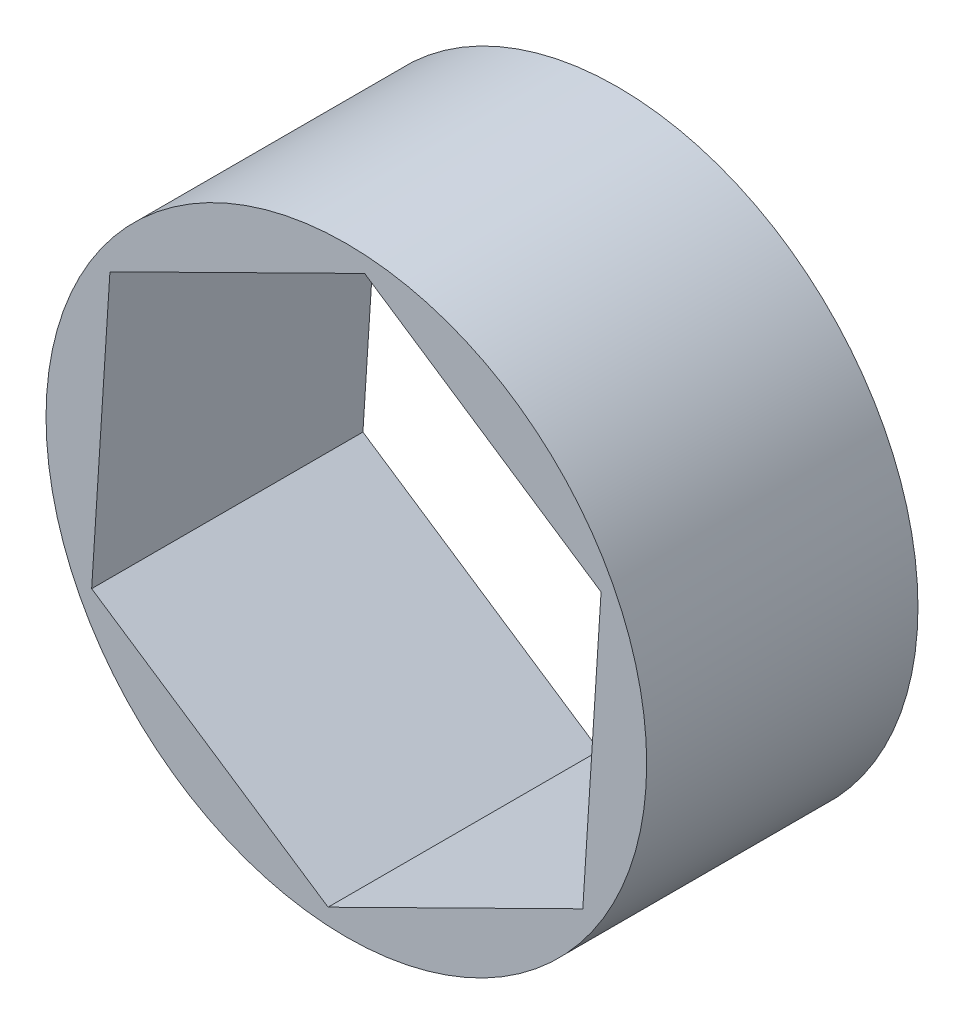
ISO-10303-21;
HEADER;
FILE_DESCRIPTION(('STEP AP214'),'2;1');
FILE_NAME('part.step','',(''),(''),'','','');
FILE_SCHEMA(('AUTOMOTIVE_DESIGN { 1 0 10303 214 1 1 1 1 }'));
ENDSEC;
DATA;
#1=APPLICATION_CONTEXT('core data for automotive mechanical design processes');
#2=APPLICATION_PROTOCOL_DEFINITION('international standard','automotive_design',2000,#1);
#3=PRODUCT_CONTEXT('',#1,'mechanical');
#4=PRODUCT('Part','Part','',(#3));
#5=PRODUCT_RELATED_PRODUCT_CATEGORY('part','',(#4));
#6=PRODUCT_DEFINITION_FORMATION('','',#4);
#7=PRODUCT_DEFINITION_CONTEXT('part definition',#1,'design');
#8=PRODUCT_DEFINITION('design','',#6,#7);
#9=PRODUCT_DEFINITION_SHAPE('','',#8);
#10=(LENGTH_UNIT() NAMED_UNIT(*) SI_UNIT(.MILLI.,.METRE.));
#11=(NAMED_UNIT(*) PLANE_ANGLE_UNIT() SI_UNIT($,.RADIAN.));
#12=(NAMED_UNIT(*) SI_UNIT($,.STERADIAN.) SOLID_ANGLE_UNIT());
#13=UNCERTAINTY_MEASURE_WITH_UNIT(LENGTH_MEASURE(1.E-05),#10,'distance_accuracy_value','');
#14=(GEOMETRIC_REPRESENTATION_CONTEXT(3) GLOBAL_UNCERTAINTY_ASSIGNED_CONTEXT((#13)) GLOBAL_UNIT_ASSIGNED_CONTEXT((#10,
#11,#12)) REPRESENTATION_CONTEXT('',''));
#15=CARTESIAN_POINT('',(0.,0.,0.));
#16=DIRECTION('',(0.,0.,1.));
#17=DIRECTION('',(1.,0.,0.));
#18=AXIS2_PLACEMENT_3D('',#15,#16,#17);
#19=CARTESIAN_POINT('',(0.,0.,7.));
#20=DIRECTION('',(0.,0.,1.));
#21=DIRECTION('',(1.,0.,0.));
#22=AXIS2_PLACEMENT_3D('',#19,#20,#21);
#23=PLANE('',#22);
#24=CARTESIAN_POINT('',(0.,0.,7.));
#25=DIRECTION('',(0.,0.,1.));
#26=DIRECTION('',(1.,0.,0.));
#27=AXIS2_PLACEMENT_3D('',#24,#25,#26);
#28=CIRCLE('',#27,7.75);
#29=CARTESIAN_POINT('',(7.75,0.,7.));
#30=VERTEX_POINT('',#29);
#31=EDGE_CURVE('E11',#30,#30,#28,.T.);
#32=ORIENTED_EDGE('',*,*,#31,.T.);
#33=EDGE_LOOP('',(#32));
#34=FACE_BOUND('',#33,.T.);
#35=DIRECTION('',(-0.0643593142463306,-0.997926790235507,0.));
#36=VECTOR('',#35,1.);
#37=CARTESIAN_POINT('',(-6.10088265997386,4.06725510664916,7.));
#38=LINE('',#37,#36);
#39=CARTESIAN_POINT('',(-6.10088265997386,4.06725510664916,7.));
#40=VERTEX_POINT('',#39);
#41=CARTESIAN_POINT('',(-6.57278757601708,-3.24989181572076,7.));
#42=VERTEX_POINT('',#41);
#43=EDGE_CURVE('E94',#40,#42,#38,.T.);
#44=ORIENTED_EDGE('',*,*,#43,.F.);
#45=DIRECTION('',(-0.896409608584179,-0.443226594010286,0.));
#46=VECTOR('',#45,1.);
#47=CARTESIAN_POINT('',(0.471904916043227,7.31714692236992,7.));
#48=LINE('',#47,#46);
#49=CARTESIAN_POINT('',(0.471904916043227,7.31714692236992,7.));
#50=VERTEX_POINT('',#49);
#51=EDGE_CURVE('E86',#50,#40,#48,.T.);
#52=ORIENTED_EDGE('',*,*,#51,.F.);
#53=DIRECTION('',(-0.832050294337849,0.554700196225221,0.));
#54=VECTOR('',#53,1.);
#55=CARTESIAN_POINT('',(6.57278757601709,3.24989181572076,7.));
#56=LINE('',#55,#54);
#57=CARTESIAN_POINT('',(6.57278757601709,3.24989181572076,7.));
#58=VERTEX_POINT('',#57);
#59=EDGE_CURVE('E114',#58,#50,#56,.T.);
#60=ORIENTED_EDGE('',*,*,#59,.F.);
#61=DIRECTION('',(0.0643593142463307,0.997926790235507,0.));
#62=VECTOR('',#61,1.);
#63=CARTESIAN_POINT('',(6.10088265997386,-4.06725510664916,7.));
#64=LINE('',#63,#62);
#65=CARTESIAN_POINT('',(6.10088265997386,-4.06725510664916,7.));
#66=VERTEX_POINT('',#65);
#67=EDGE_CURVE('E112',#66,#58,#64,.T.);
#68=ORIENTED_EDGE('',*,*,#67,.F.);
#69=DIRECTION('',(0.896409608584179,0.443226594010286,0.));
#70=VECTOR('',#69,1.);
#71=CARTESIAN_POINT('',(-0.471904916043223,-7.31714692236992,7.));
#72=LINE('',#71,#70);
#73=CARTESIAN_POINT('',(-0.471904916043223,-7.31714692236992,7.));
#74=VERTEX_POINT('',#73);
#75=EDGE_CURVE('E108',#74,#66,#72,.T.);
#76=ORIENTED_EDGE('',*,*,#75,.F.);
#77=DIRECTION('',(0.832050294337849,-0.554700196225222,0.));
#78=VECTOR('',#77,1.);
#79=CARTESIAN_POINT('',(-6.57278757601708,-3.24989181572076,7.));
#80=LINE('',#79,#78);
#81=EDGE_CURVE('E106',#42,#74,#80,.T.);
#82=ORIENTED_EDGE('',*,*,#81,.F.);
#83=EDGE_LOOP('',(#44,#52,#60,#68,#76,#82));
#84=FACE_BOUND('',#83,.T.);
#85=ADVANCED_FACE('F33',(#34,#84),#23,.T.);
#86=CARTESIAN_POINT('',(0.,0.,0.));
#87=DIRECTION('',(0.,0.,1.));
#88=DIRECTION('',(1.,0.,0.));
#89=AXIS2_PLACEMENT_3D('',#86,#87,#88);
#90=PLANE('',#89);
#91=CARTESIAN_POINT('',(0.,0.,0.));
#92=DIRECTION('',(0.,0.,1.));
#93=DIRECTION('',(1.,0.,0.));
#94=AXIS2_PLACEMENT_3D('',#91,#92,#93);
#95=CIRCLE('',#94,7.75);
#96=CARTESIAN_POINT('',(7.75,0.,0.));
#97=VERTEX_POINT('',#96);
#98=EDGE_CURVE('E37',#97,#97,#95,.T.);
#99=ORIENTED_EDGE('',*,*,#98,.F.);
#100=EDGE_LOOP('',(#99));
#101=FACE_BOUND('',#100,.T.);
#102=DIRECTION('',(-0.896409608584179,-0.443226594010286,0.));
#103=VECTOR('',#102,1.);
#104=CARTESIAN_POINT('',(0.471904916043227,7.31714692236992,0.));
#105=LINE('',#104,#103);
#106=CARTESIAN_POINT('',(0.471904916043227,7.31714692236992,0.));
#107=VERTEX_POINT('',#106);
#108=CARTESIAN_POINT('',(-6.10088265997386,4.06725510664916,0.));
#109=VERTEX_POINT('',#108);
#110=EDGE_CURVE('E56',#107,#109,#105,.T.);
#111=ORIENTED_EDGE('',*,*,#110,.T.);
#112=DIRECTION('',(-0.0643593142463306,-0.997926790235507,0.));
#113=VECTOR('',#112,1.);
#114=CARTESIAN_POINT('',(-6.10088265997386,4.06725510664916,0.));
#115=LINE('',#114,#113);
#116=CARTESIAN_POINT('',(-6.57278757601708,-3.24989181572076,0.));
#117=VERTEX_POINT('',#116);
#118=EDGE_CURVE('E101',#109,#117,#115,.T.);
#119=ORIENTED_EDGE('',*,*,#118,.T.);
#120=DIRECTION('',(0.832050294337849,-0.554700196225222,0.));
#121=VECTOR('',#120,1.);
#122=CARTESIAN_POINT('',(-6.57278757601708,-3.24989181572076,0.));
#123=LINE('',#122,#121);
#124=CARTESIAN_POINT('',(-0.471904916043223,-7.31714692236992,0.));
#125=VERTEX_POINT('',#124);
#126=EDGE_CURVE('E118',#117,#125,#123,.T.);
#127=ORIENTED_EDGE('',*,*,#126,.T.);
#128=DIRECTION('',(0.896409608584179,0.443226594010286,0.));
#129=VECTOR('',#128,1.);
#130=CARTESIAN_POINT('',(-0.471904916043223,-7.31714692236992,0.));
#131=LINE('',#130,#129);
#132=CARTESIAN_POINT('',(6.10088265997386,-4.06725510664916,0.));
#133=VERTEX_POINT('',#132);
#134=EDGE_CURVE('E121',#125,#133,#131,.T.);
#135=ORIENTED_EDGE('',*,*,#134,.T.);
#136=DIRECTION('',(0.0643593142463307,0.997926790235507,0.));
#137=VECTOR('',#136,1.);
#138=CARTESIAN_POINT('',(6.10088265997386,-4.06725510664916,0.));
#139=LINE('',#138,#137);
#140=CARTESIAN_POINT('',(6.57278757601709,3.24989181572076,0.));
#141=VERTEX_POINT('',#140);
#142=EDGE_CURVE('E124',#133,#141,#139,.T.);
#143=ORIENTED_EDGE('',*,*,#142,.T.);
#144=DIRECTION('',(-0.832050294337849,0.554700196225221,0.));
#145=VECTOR('',#144,1.);
#146=CARTESIAN_POINT('',(6.57278757601709,3.24989181572076,0.));
#147=LINE('',#146,#145);
#148=EDGE_CURVE('E95',#141,#107,#147,.T.);
#149=ORIENTED_EDGE('',*,*,#148,.T.);
#150=EDGE_LOOP('',(#111,#119,#127,#135,#143,#149));
#151=FACE_BOUND('',#150,.T.);
#152=ADVANCED_FACE('F141',(#101,#151),#90,.F.);
#153=CARTESIAN_POINT('',(0.,0.,7.));
#154=DIRECTION('',(0.,0.,-1.));
#155=DIRECTION('',(-1.,0.,0.));
#156=AXIS2_PLACEMENT_3D('',#153,#154,#155);
#157=CYLINDRICAL_SURFACE('',#156,7.75);
#158=ORIENTED_EDGE('',*,*,#31,.F.);
#159=EDGE_LOOP('',(#158));
#160=FACE_BOUND('',#159,.T.);
#161=ORIENTED_EDGE('',*,*,#98,.T.);
#162=EDGE_LOOP('',(#161));
#163=FACE_BOUND('',#162,.T.);
#164=ADVANCED_FACE('F35',(#160,#163),#157,.T.);
#165=CARTESIAN_POINT('',(0.471904916043227,7.31714692236992,7.));
#166=DIRECTION('',(0.443226594010286,-0.896409608584179,0.));
#167=DIRECTION('',(0.896409608584179,0.443226594010286,0.));
#168=AXIS2_PLACEMENT_3D('',#165,#166,#167);
#169=PLANE('',#168);
#170=ORIENTED_EDGE('',*,*,#110,.F.);
#171=DIRECTION('',(0.,0.,-1.));
#172=VECTOR('',#171,1.);
#173=CARTESIAN_POINT('',(0.471904916043227,7.31714692236992,7.));
#174=LINE('',#173,#172);
#175=EDGE_CURVE('E90',#50,#107,#174,.T.);
#176=ORIENTED_EDGE('',*,*,#175,.F.);
#177=ORIENTED_EDGE('',*,*,#51,.T.);
#178=DIRECTION('',(0.,0.,-1.));
#179=VECTOR('',#178,1.);
#180=CARTESIAN_POINT('',(-6.10088265997386,4.06725510664916,7.));
#181=LINE('',#180,#179);
#182=EDGE_CURVE('E89',#40,#109,#181,.T.);
#183=ORIENTED_EDGE('',*,*,#182,.T.);
#184=EDGE_LOOP('',(#170,#176,#177,#183));
#185=FACE_BOUND('',#184,.T.);
#186=ADVANCED_FACE('F88',(#185),#169,.T.);
#187=CARTESIAN_POINT('',(-6.10088265997386,4.06725510664916,7.));
#188=DIRECTION('',(0.997926790235507,-0.0643593142463306,0.));
#189=DIRECTION('',(0.0643593142463306,0.997926790235507,0.));
#190=AXIS2_PLACEMENT_3D('',#187,#188,#189);
#191=PLANE('',#190);
#192=ORIENTED_EDGE('',*,*,#118,.F.);
#193=ORIENTED_EDGE('',*,*,#182,.F.);
#194=ORIENTED_EDGE('',*,*,#43,.T.);
#195=DIRECTION('',(0.,0.,-1.));
#196=VECTOR('',#195,1.);
#197=CARTESIAN_POINT('',(-6.57278757601708,-3.24989181572076,7.));
#198=LINE('',#197,#196);
#199=EDGE_CURVE('E102',#42,#117,#198,.T.);
#200=ORIENTED_EDGE('',*,*,#199,.T.);
#201=EDGE_LOOP('',(#192,#193,#194,#200));
#202=FACE_BOUND('',#201,.T.);
#203=ADVANCED_FACE('F98',(#202),#191,.T.);
#204=CARTESIAN_POINT('',(-6.57278757601708,-3.24989181572076,7.));
#205=DIRECTION('',(0.554700196225221,0.832050294337849,0.));
#206=DIRECTION('',(-0.832050294337849,0.554700196225221,0.));
#207=AXIS2_PLACEMENT_3D('',#204,#205,#206);
#208=PLANE('',#207);
#209=ORIENTED_EDGE('',*,*,#126,.F.);
#210=ORIENTED_EDGE('',*,*,#199,.F.);
#211=ORIENTED_EDGE('',*,*,#81,.T.);
#212=DIRECTION('',(0.,0.,-1.));
#213=VECTOR('',#212,1.);
#214=CARTESIAN_POINT('',(-0.471904916043223,-7.31714692236992,7.));
#215=LINE('',#214,#213);
#216=EDGE_CURVE('E133',#74,#125,#215,.T.);
#217=ORIENTED_EDGE('',*,*,#216,.T.);
#218=EDGE_LOOP('',(#209,#210,#211,#217));
#219=FACE_BOUND('',#218,.T.);
#220=ADVANCED_FACE('F137',(#219),#208,.T.);
#221=CARTESIAN_POINT('',(-0.471904916043223,-7.31714692236992,7.));
#222=DIRECTION('',(-0.443226594010286,0.896409608584179,0.));
#223=DIRECTION('',(-0.896409608584179,-0.443226594010286,0.));
#224=AXIS2_PLACEMENT_3D('',#221,#222,#223);
#225=PLANE('',#224);
#226=ORIENTED_EDGE('',*,*,#134,.F.);
#227=ORIENTED_EDGE('',*,*,#216,.F.);
#228=ORIENTED_EDGE('',*,*,#75,.T.);
#229=DIRECTION('',(0.,0.,-1.));
#230=VECTOR('',#229,1.);
#231=CARTESIAN_POINT('',(6.10088265997386,-4.06725510664916,7.));
#232=LINE('',#231,#230);
#233=EDGE_CURVE('E131',#66,#133,#232,.T.);
#234=ORIENTED_EDGE('',*,*,#233,.T.);
#235=EDGE_LOOP('',(#226,#227,#228,#234));
#236=FACE_BOUND('',#235,.T.);
#237=ADVANCED_FACE('F149',(#236),#225,.T.);
#238=CARTESIAN_POINT('',(6.10088265997386,-4.06725510664916,7.));
#239=DIRECTION('',(-0.997926790235507,0.0643593142463307,0.));
#240=DIRECTION('',(-0.0643593142463307,-0.997926790235507,0.));
#241=AXIS2_PLACEMENT_3D('',#238,#239,#240);
#242=PLANE('',#241);
#243=ORIENTED_EDGE('',*,*,#142,.F.);
#244=ORIENTED_EDGE('',*,*,#233,.F.);
#245=ORIENTED_EDGE('',*,*,#67,.T.);
#246=DIRECTION('',(0.,0.,-1.));
#247=VECTOR('',#246,1.);
#248=CARTESIAN_POINT('',(6.57278757601709,3.24989181572076,7.));
#249=LINE('',#248,#247);
#250=EDGE_CURVE('E48',#58,#141,#249,.T.);
#251=ORIENTED_EDGE('',*,*,#250,.T.);
#252=EDGE_LOOP('',(#243,#244,#245,#251));
#253=FACE_BOUND('',#252,.T.);
#254=ADVANCED_FACE('F147',(#253),#242,.T.);
#255=CARTESIAN_POINT('',(6.57278757601709,3.24989181572076,7.));
#256=DIRECTION('',(-0.554700196225221,-0.832050294337849,0.));
#257=DIRECTION('',(0.832050294337849,-0.554700196225221,0.));
#258=AXIS2_PLACEMENT_3D('',#255,#256,#257);
#259=PLANE('',#258);
#260=ORIENTED_EDGE('',*,*,#148,.F.);
#261=ORIENTED_EDGE('',*,*,#250,.F.);
#262=ORIENTED_EDGE('',*,*,#59,.T.);
#263=ORIENTED_EDGE('',*,*,#175,.T.);
#264=EDGE_LOOP('',(#260,#261,#262,#263));
#265=FACE_BOUND('',#264,.T.);
#266=ADVANCED_FACE('F143',(#265),#259,.T.);
#267=CLOSED_SHELL('',(#85,#152,#164,#186,#203,#220,#237,#254,#266));
#268=MANIFOLD_SOLID_BREP('B2',#267);
#269=ADVANCED_BREP_SHAPE_REPRESENTATION('',(#18,#268),#14);
#270=SHAPE_DEFINITION_REPRESENTATION(#9,#269);
ENDSEC;
END-ISO-10303-21;
